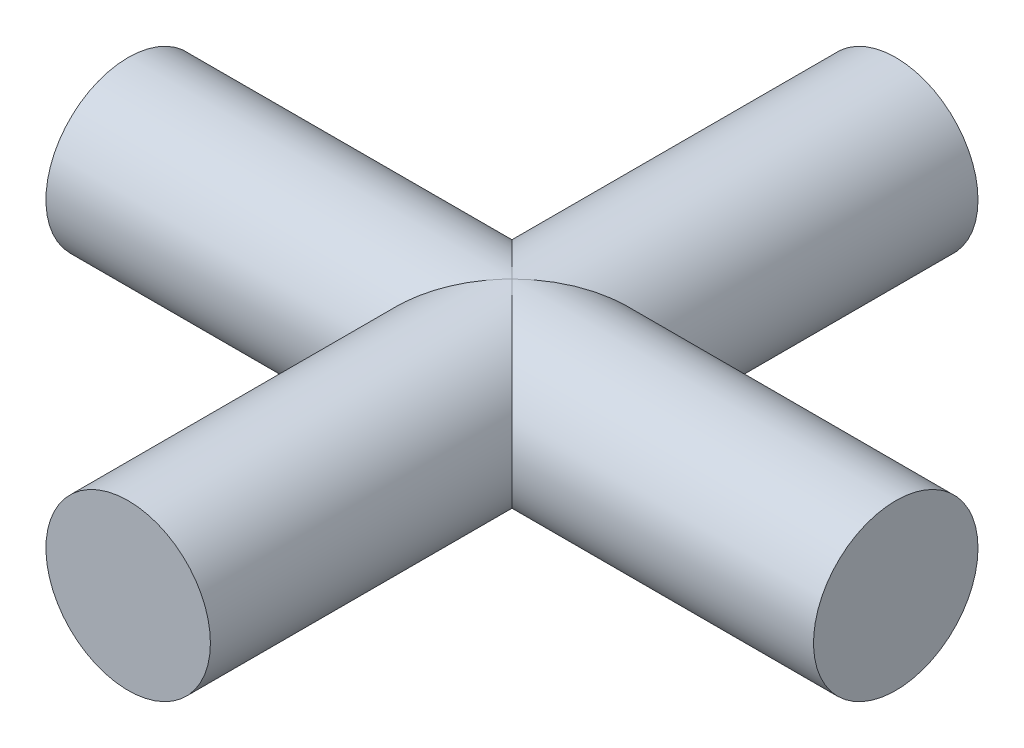
ISO-10303-21;
HEADER;
FILE_DESCRIPTION(('STEP AP214'),'2;1');
FILE_NAME('part.step','',(''),(''),'','','');
FILE_SCHEMA(('AUTOMOTIVE_DESIGN { 1 0 10303 214 1 1 1 1 }'));
ENDSEC;
DATA;
#1=APPLICATION_CONTEXT('core data for automotive mechanical design processes');
#2=APPLICATION_PROTOCOL_DEFINITION('international standard','automotive_design',2000,#1);
#3=PRODUCT_CONTEXT('',#1,'mechanical');
#4=PRODUCT('Part','Part','',(#3));
#5=PRODUCT_RELATED_PRODUCT_CATEGORY('part','',(#4));
#6=PRODUCT_DEFINITION_FORMATION('','',#4);
#7=PRODUCT_DEFINITION_CONTEXT('part definition',#1,'design');
#8=PRODUCT_DEFINITION('design','',#6,#7);
#9=PRODUCT_DEFINITION_SHAPE('','',#8);
#10=(LENGTH_UNIT() NAMED_UNIT(*) SI_UNIT(.MILLI.,.METRE.));
#11=(NAMED_UNIT(*) PLANE_ANGLE_UNIT() SI_UNIT($,.RADIAN.));
#12=(NAMED_UNIT(*) SI_UNIT($,.STERADIAN.) SOLID_ANGLE_UNIT());
#13=UNCERTAINTY_MEASURE_WITH_UNIT(LENGTH_MEASURE(1.E-05),#10,'distance_accuracy_value','');
#14=(GEOMETRIC_REPRESENTATION_CONTEXT(3) GLOBAL_UNCERTAINTY_ASSIGNED_CONTEXT((#13)) GLOBAL_UNIT_ASSIGNED_CONTEXT((#10,
#11,#12)) REPRESENTATION_CONTEXT('',''));
#15=CARTESIAN_POINT('',(0.,0.,0.));
#16=DIRECTION('',(0.,0.,1.));
#17=DIRECTION('',(1.,0.,0.));
#18=AXIS2_PLACEMENT_3D('',#15,#16,#17);
#19=CARTESIAN_POINT('',(14.,0.,0.));
#20=DIRECTION('',(-1.,0.,0.));
#21=DIRECTION('',(0.,0.,1.));
#22=AXIS2_PLACEMENT_3D('',#19,#20,#21);
#23=CYLINDRICAL_SURFACE('',#22,1.5);
#24=CARTESIAN_POINT('',(14.,0.,0.));
#25=DIRECTION('',(1.,0.,0.));
#26=DIRECTION('',(0.,0.,-1.));
#27=AXIS2_PLACEMENT_3D('',#24,#25,#26);
#28=CIRCLE('',#27,1.5);
#29=CARTESIAN_POINT('',(14.,0.,-1.5));
#30=VERTEX_POINT('',#29);
#31=EDGE_CURVE('E60',#30,#30,#28,.T.);
#32=ORIENTED_EDGE('',*,*,#31,.F.);
#33=EDGE_LOOP('',(#32));
#34=FACE_BOUND('',#33,.T.);
#35=CARTESIAN_POINT('',(7.,0.,0.));
#36=DIRECTION('',(-0.707106781186547,0.,-0.707106781186547));
#37=DIRECTION('',(-0.707106781186547,0.,0.707106781186547));
#38=AXIS2_PLACEMENT_3D('',#35,#36,#37);
#39=ELLIPSE('',#38,2.12132034355964,1.5);
#40=CARTESIAN_POINT('',(7.,1.5,0.));
#41=VERTEX_POINT('',#40);
#42=CARTESIAN_POINT('',(7.,-1.5,0.));
#43=VERTEX_POINT('',#42);
#44=EDGE_CURVE('E44',#41,#43,#39,.T.);
#45=ORIENTED_EDGE('',*,*,#44,.F.);
#46=CARTESIAN_POINT('',(7.,0.,0.));
#47=DIRECTION('',(-0.707106781186547,0.,0.707106781186547));
#48=DIRECTION('',(-0.707106781186547,0.,-0.707106781186547));
#49=AXIS2_PLACEMENT_3D('',#46,#47,#48);
#50=ELLIPSE('',#49,2.12132034355964,1.5);
#51=EDGE_CURVE('E56',#43,#41,#50,.T.);
#52=ORIENTED_EDGE('',*,*,#51,.F.);
#53=EDGE_LOOP('',(#45,#52));
#54=FACE_BOUND('',#53,.T.);
#55=ADVANCED_FACE('F36',(#34,#54),#23,.T.);
#56=CARTESIAN_POINT('',(14.,0.,0.));
#57=DIRECTION('',(1.,0.,0.));
#58=DIRECTION('',(0.,0.,-1.));
#59=AXIS2_PLACEMENT_3D('',#56,#57,#58);
#60=PLANE('',#59);
#61=ORIENTED_EDGE('',*,*,#31,.T.);
#62=EDGE_LOOP('',(#61));
#63=FACE_BOUND('',#62,.T.);
#64=ADVANCED_FACE('F83',(#63),#60,.T.);
#65=CARTESIAN_POINT('',(7.,0.,-7.));
#66=DIRECTION('',(0.,0.,1.));
#67=DIRECTION('',(1.,0.,0.));
#68=AXIS2_PLACEMENT_3D('',#65,#66,#67);
#69=PLANE('',#68);
#70=CARTESIAN_POINT('',(7.,0.,-7.));
#71=DIRECTION('',(0.,0.,1.));
#72=DIRECTION('',(1.,0.,0.));
#73=AXIS2_PLACEMENT_3D('',#70,#71,#72);
#74=CIRCLE('',#73,1.5);
#75=CARTESIAN_POINT('',(8.5,0.,-7.));
#76=VERTEX_POINT('',#75);
#77=EDGE_CURVE('E97',#76,#76,#74,.T.);
#78=ORIENTED_EDGE('',*,*,#77,.F.);
#79=EDGE_LOOP('',(#78));
#80=FACE_BOUND('',#79,.T.);
#81=ADVANCED_FACE('F80',(#80),#69,.F.);
#82=CARTESIAN_POINT('',(7.,0.,7.));
#83=DIRECTION('',(0.,0.,-1.));
#84=DIRECTION('',(-1.,0.,0.));
#85=AXIS2_PLACEMENT_3D('',#82,#83,#84);
#86=CYLINDRICAL_SURFACE('',#85,1.5);
#87=ORIENTED_EDGE('',*,*,#77,.T.);
#88=EDGE_LOOP('',(#87));
#89=FACE_BOUND('',#88,.T.);
#90=CARTESIAN_POINT('',(7.,0.,0.));
#91=DIRECTION('',(-0.707106781186547,0.,0.707106781186547));
#92=DIRECTION('',(-0.707106781186547,0.,-0.707106781186547));
#93=AXIS2_PLACEMENT_3D('',#90,#91,#92);
#94=ELLIPSE('',#93,2.12132034355964,1.5);
#95=EDGE_CURVE('E50',#43,#41,#94,.F.);
#96=ORIENTED_EDGE('',*,*,#95,.T.);
#97=ORIENTED_EDGE('',*,*,#44,.T.);
#98=EDGE_LOOP('',(#96,#97));
#99=FACE_BOUND('',#98,.T.);
#100=ADVANCED_FACE('F62',(#89,#99),#86,.T.);
#101=CARTESIAN_POINT('',(0.,0.,0.));
#102=DIRECTION('',(1.,0.,0.));
#103=DIRECTION('',(0.,0.,-1.));
#104=AXIS2_PLACEMENT_3D('',#101,#102,#103);
#105=PLANE('',#104);
#106=CARTESIAN_POINT('',(0.,0.,0.));
#107=DIRECTION('',(1.,0.,0.));
#108=DIRECTION('',(0.,0.,-1.));
#109=AXIS2_PLACEMENT_3D('',#106,#107,#108);
#110=CIRCLE('',#109,1.5);
#111=CARTESIAN_POINT('',(0.,0.,-1.5));
#112=VERTEX_POINT('',#111);
#113=EDGE_CURVE('E91',#112,#112,#110,.T.);
#114=ORIENTED_EDGE('',*,*,#113,.F.);
#115=EDGE_LOOP('',(#114));
#116=FACE_BOUND('',#115,.T.);
#117=ADVANCED_FACE('F74',(#116),#105,.F.);
#118=ORIENTED_EDGE('',*,*,#113,.T.);
#119=EDGE_LOOP('',(#118));
#120=FACE_BOUND('',#119,.T.);
#121=CARTESIAN_POINT('',(7.,0.,0.));
#122=DIRECTION('',(-0.707106781186547,0.,-0.707106781186547));
#123=DIRECTION('',(-0.707106781186547,0.,0.707106781186547));
#124=AXIS2_PLACEMENT_3D('',#121,#122,#123);
#125=ELLIPSE('',#124,2.12132034355964,1.5);
#126=EDGE_CURVE('E11',#41,#43,#125,.F.);
#127=ORIENTED_EDGE('',*,*,#126,.F.);
#128=ORIENTED_EDGE('',*,*,#95,.F.);
#129=EDGE_LOOP('',(#127,#128));
#130=FACE_BOUND('',#129,.T.);
#131=ADVANCED_FACE('F38',(#120,#130),#23,.T.);
#132=CARTESIAN_POINT('',(7.,0.,7.));
#133=DIRECTION('',(0.,0.,1.));
#134=DIRECTION('',(1.,0.,0.));
#135=AXIS2_PLACEMENT_3D('',#132,#133,#134);
#136=CIRCLE('',#135,1.5);
#137=CARTESIAN_POINT('',(8.5,0.,7.));
#138=VERTEX_POINT('',#137);
#139=EDGE_CURVE('E94',#138,#138,#136,.T.);
#140=ORIENTED_EDGE('',*,*,#139,.F.);
#141=EDGE_LOOP('',(#140));
#142=FACE_BOUND('',#141,.T.);
#143=ORIENTED_EDGE('',*,*,#51,.T.);
#144=ORIENTED_EDGE('',*,*,#126,.T.);
#145=EDGE_LOOP('',(#143,#144));
#146=FACE_BOUND('',#145,.T.);
#147=ADVANCED_FACE('F63',(#142,#146),#86,.T.);
#148=CARTESIAN_POINT('',(7.,0.,7.));
#149=DIRECTION('',(0.,0.,1.));
#150=DIRECTION('',(1.,0.,0.));
#151=AXIS2_PLACEMENT_3D('',#148,#149,#150);
#152=PLANE('',#151);
#153=ORIENTED_EDGE('',*,*,#139,.T.);
#154=EDGE_LOOP('',(#153));
#155=FACE_BOUND('',#154,.T.);
#156=ADVANCED_FACE('F65',(#155),#152,.T.);
#157=CLOSED_SHELL('',(#55,#64,#81,#100,#117,#131,#147,#156));
#158=MANIFOLD_SOLID_BREP('B2',#157);
#159=ADVANCED_BREP_SHAPE_REPRESENTATION('',(#18,#158),#14);
#160=SHAPE_DEFINITION_REPRESENTATION(#9,#159);
ENDSEC;
END-ISO-10303-21;
